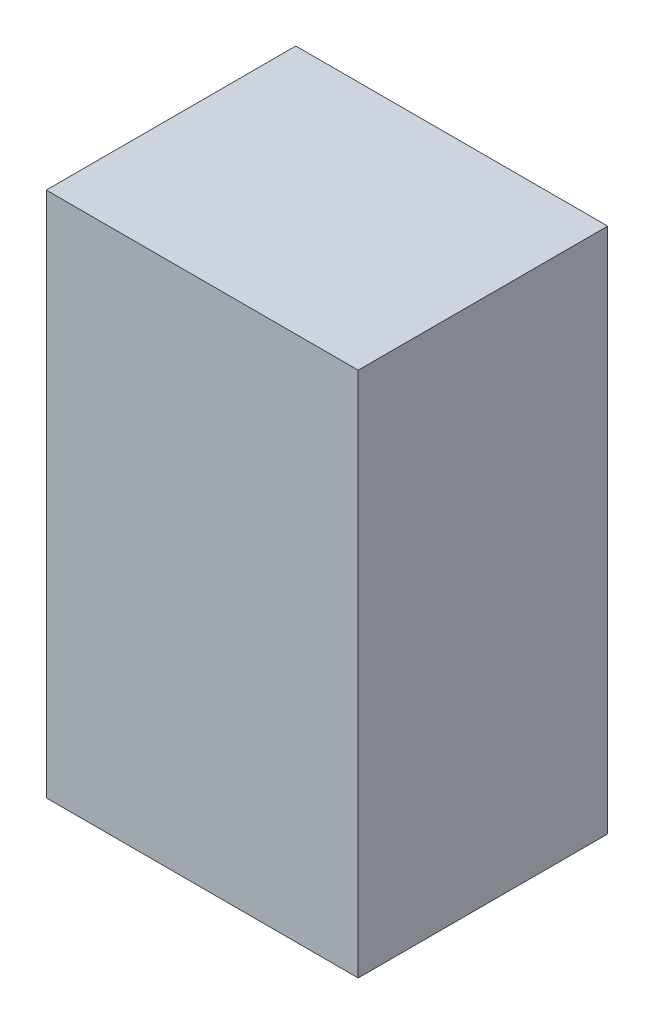
ISO-10303-21;
HEADER;
FILE_DESCRIPTION(('STEP AP214'),'2;1');
FILE_NAME('part.step','',(''),(''),'','','');
FILE_SCHEMA(('AUTOMOTIVE_DESIGN { 1 0 10303 214 1 1 1 1 }'));
ENDSEC;
DATA;
#1=APPLICATION_CONTEXT('core data for automotive mechanical design processes');
#2=APPLICATION_PROTOCOL_DEFINITION('international standard','automotive_design',2000,#1);
#3=PRODUCT_CONTEXT('',#1,'mechanical');
#4=PRODUCT('Part','Part','',(#3));
#5=PRODUCT_RELATED_PRODUCT_CATEGORY('part','',(#4));
#6=PRODUCT_DEFINITION_FORMATION('','',#4);
#7=PRODUCT_DEFINITION_CONTEXT('part definition',#1,'design');
#8=PRODUCT_DEFINITION('design','',#6,#7);
#9=PRODUCT_DEFINITION_SHAPE('','',#8);
#10=(LENGTH_UNIT() NAMED_UNIT(*) SI_UNIT(.MILLI.,.METRE.));
#11=(NAMED_UNIT(*) PLANE_ANGLE_UNIT() SI_UNIT($,.RADIAN.));
#12=(NAMED_UNIT(*) SI_UNIT($,.STERADIAN.) SOLID_ANGLE_UNIT());
#13=UNCERTAINTY_MEASURE_WITH_UNIT(LENGTH_MEASURE(1.E-05),#10,'distance_accuracy_value','');
#14=(GEOMETRIC_REPRESENTATION_CONTEXT(3) GLOBAL_UNCERTAINTY_ASSIGNED_CONTEXT((#13)) GLOBAL_UNIT_ASSIGNED_CONTEXT((#10,
#11,#12)) REPRESENTATION_CONTEXT('',''));
#15=CARTESIAN_POINT('',(0.,0.,0.));
#16=DIRECTION('',(0.,0.,1.));
#17=DIRECTION('',(1.,0.,0.));
#18=AXIS2_PLACEMENT_3D('',#15,#16,#17);
#19=CARTESIAN_POINT('',(-0.80000094,1.34999984,1.27999998));
#20=DIRECTION('',(0.,0.,1.));
#21=DIRECTION('',(1.,0.,0.));
#22=AXIS2_PLACEMENT_3D('',#19,#20,#21);
#23=PLANE('',#22);
#24=DIRECTION('',(0.,1.,0.));
#25=VECTOR('',#24,1.);
#26=CARTESIAN_POINT('',(-0.80000094,-1.34999984,1.27999998));
#27=LINE('',#26,#25);
#28=CARTESIAN_POINT('',(-0.80000094,-1.34999984,1.27999998));
#29=VERTEX_POINT('',#28);
#30=CARTESIAN_POINT('',(-0.80000094,1.34999984,1.27999998));
#31=VERTEX_POINT('',#30);
#32=EDGE_CURVE('E26',#29,#31,#27,.T.);
#33=ORIENTED_EDGE('',*,*,#32,.F.);
#34=DIRECTION('',(-1.,0.,0.));
#35=VECTOR('',#34,1.);
#36=CARTESIAN_POINT('',(0.80000094,-1.34999984,1.27999998));
#37=LINE('',#36,#35);
#38=CARTESIAN_POINT('',(0.80000094,-1.34999984,1.27999998));
#39=VERTEX_POINT('',#38);
#40=EDGE_CURVE('E64',#39,#29,#37,.T.);
#41=ORIENTED_EDGE('',*,*,#40,.F.);
#42=DIRECTION('',(0.,-1.,0.));
#43=VECTOR('',#42,1.);
#44=CARTESIAN_POINT('',(0.80000094,1.34999984,1.27999998));
#45=LINE('',#44,#43);
#46=CARTESIAN_POINT('',(0.80000094,1.34999984,1.27999998));
#47=VERTEX_POINT('',#46);
#48=EDGE_CURVE('E19',#47,#39,#45,.T.);
#49=ORIENTED_EDGE('',*,*,#48,.F.);
#50=DIRECTION('',(1.,0.,0.));
#51=VECTOR('',#50,1.);
#52=CARTESIAN_POINT('',(-0.80000094,1.34999984,1.27999998));
#53=LINE('',#52,#51);
#54=EDGE_CURVE('E97',#31,#47,#53,.T.);
#55=ORIENTED_EDGE('',*,*,#54,.F.);
#56=EDGE_LOOP('',(#33,#41,#49,#55));
#57=FACE_BOUND('',#56,.T.);
#58=ADVANCED_FACE('F16',(#57),#23,.T.);
#59=CARTESIAN_POINT('',(-0.80000094,1.34999984,0.));
#60=DIRECTION('',(0.,0.,1.));
#61=DIRECTION('',(1.,0.,0.));
#62=AXIS2_PLACEMENT_3D('',#59,#60,#61);
#63=PLANE('',#62);
#64=DIRECTION('',(1.,0.,0.));
#65=VECTOR('',#64,1.);
#66=CARTESIAN_POINT('',(-0.80000094,1.34999984,0.));
#67=LINE('',#66,#65);
#68=CARTESIAN_POINT('',(-0.80000094,1.34999984,0.));
#69=VERTEX_POINT('',#68);
#70=CARTESIAN_POINT('',(0.80000094,1.34999984,0.));
#71=VERTEX_POINT('',#70);
#72=EDGE_CURVE('E84',#69,#71,#67,.T.);
#73=ORIENTED_EDGE('',*,*,#72,.T.);
#74=DIRECTION('',(0.,-1.,0.));
#75=VECTOR('',#74,1.);
#76=CARTESIAN_POINT('',(0.80000094,1.34999984,0.));
#77=LINE('',#76,#75);
#78=CARTESIAN_POINT('',(0.80000094,-1.34999984,0.));
#79=VERTEX_POINT('',#78);
#80=EDGE_CURVE('E81',#71,#79,#77,.T.);
#81=ORIENTED_EDGE('',*,*,#80,.T.);
#82=DIRECTION('',(-1.,0.,0.));
#83=VECTOR('',#82,1.);
#84=CARTESIAN_POINT('',(0.80000094,-1.34999984,0.));
#85=LINE('',#84,#83);
#86=CARTESIAN_POINT('',(-0.80000094,-1.34999984,0.));
#87=VERTEX_POINT('',#86);
#88=EDGE_CURVE('E71',#79,#87,#85,.T.);
#89=ORIENTED_EDGE('',*,*,#88,.T.);
#90=DIRECTION('',(0.,1.,0.));
#91=VECTOR('',#90,1.);
#92=CARTESIAN_POINT('',(-0.80000094,-1.34999984,0.));
#93=LINE('',#92,#91);
#94=EDGE_CURVE('E11',#87,#69,#93,.T.);
#95=ORIENTED_EDGE('',*,*,#94,.T.);
#96=EDGE_LOOP('',(#73,#81,#89,#95));
#97=FACE_BOUND('',#96,.T.);
#98=ADVANCED_FACE('F82',(#97),#63,.F.);
#99=CARTESIAN_POINT('',(-0.80000094,-1.34999984,0.));
#100=DIRECTION('',(-1.,0.,0.));
#101=DIRECTION('',(0.,0.,1.));
#102=AXIS2_PLACEMENT_3D('',#99,#100,#101);
#103=PLANE('',#102);
#104=DIRECTION('',(0.,0.,1.));
#105=VECTOR('',#104,1.);
#106=CARTESIAN_POINT('',(-0.80000094,-1.34999984,0.));
#107=LINE('',#106,#105);
#108=EDGE_CURVE('E77',#87,#29,#107,.T.);
#109=ORIENTED_EDGE('',*,*,#108,.T.);
#110=ORIENTED_EDGE('',*,*,#32,.T.);
#111=DIRECTION('',(0.,0.,1.));
#112=VECTOR('',#111,1.);
#113=CARTESIAN_POINT('',(-0.80000094,1.34999984,0.));
#114=LINE('',#113,#112);
#115=EDGE_CURVE('E111',#69,#31,#114,.T.);
#116=ORIENTED_EDGE('',*,*,#115,.F.);
#117=ORIENTED_EDGE('',*,*,#94,.F.);
#118=EDGE_LOOP('',(#109,#110,#116,#117));
#119=FACE_BOUND('',#118,.T.);
#120=ADVANCED_FACE('F115',(#119),#103,.T.);
#121=CARTESIAN_POINT('',(0.80000094,-1.34999984,0.));
#122=DIRECTION('',(0.,-1.,0.));
#123=DIRECTION('',(0.,0.,-1.));
#124=AXIS2_PLACEMENT_3D('',#121,#122,#123);
#125=PLANE('',#124);
#126=DIRECTION('',(0.,0.,1.));
#127=VECTOR('',#126,1.);
#128=CARTESIAN_POINT('',(0.80000094,-1.34999984,0.));
#129=LINE('',#128,#127);
#130=EDGE_CURVE('E75',#79,#39,#129,.T.);
#131=ORIENTED_EDGE('',*,*,#130,.T.);
#132=ORIENTED_EDGE('',*,*,#40,.T.);
#133=ORIENTED_EDGE('',*,*,#108,.F.);
#134=ORIENTED_EDGE('',*,*,#88,.F.);
#135=EDGE_LOOP('',(#131,#132,#133,#134));
#136=FACE_BOUND('',#135,.T.);
#137=ADVANCED_FACE('F73',(#136),#125,.T.);
#138=CARTESIAN_POINT('',(0.80000094,1.34999984,0.));
#139=DIRECTION('',(1.,0.,0.));
#140=DIRECTION('',(0.,1.,0.));
#141=AXIS2_PLACEMENT_3D('',#138,#139,#140);
#142=PLANE('',#141);
#143=DIRECTION('',(0.,0.,1.));
#144=VECTOR('',#143,1.);
#145=CARTESIAN_POINT('',(0.80000094,1.34999984,0.));
#146=LINE('',#145,#144);
#147=EDGE_CURVE('E103',#71,#47,#146,.T.);
#148=ORIENTED_EDGE('',*,*,#147,.T.);
#149=ORIENTED_EDGE('',*,*,#48,.T.);
#150=ORIENTED_EDGE('',*,*,#130,.F.);
#151=ORIENTED_EDGE('',*,*,#80,.F.);
#152=EDGE_LOOP('',(#148,#149,#150,#151));
#153=FACE_BOUND('',#152,.T.);
#154=ADVANCED_FACE('F90',(#153),#142,.T.);
#155=CARTESIAN_POINT('',(-0.80000094,1.34999984,0.));
#156=DIRECTION('',(0.,1.,0.));
#157=DIRECTION('',(1.,0.,0.));
#158=AXIS2_PLACEMENT_3D('',#155,#156,#157);
#159=PLANE('',#158);
#160=ORIENTED_EDGE('',*,*,#115,.T.);
#161=ORIENTED_EDGE('',*,*,#54,.T.);
#162=ORIENTED_EDGE('',*,*,#147,.F.);
#163=ORIENTED_EDGE('',*,*,#72,.F.);
#164=EDGE_LOOP('',(#160,#161,#162,#163));
#165=FACE_BOUND('',#164,.T.);
#166=ADVANCED_FACE('F118',(#165),#159,.T.);
#167=CLOSED_SHELL('',(#58,#98,#120,#137,#154,#166));
#168=MANIFOLD_SOLID_BREP('B1',#167);
#169=ADVANCED_BREP_SHAPE_REPRESENTATION('',(#18,#168),#14);
#170=SHAPE_DEFINITION_REPRESENTATION(#9,#169);
ENDSEC;
END-ISO-10303-21;
